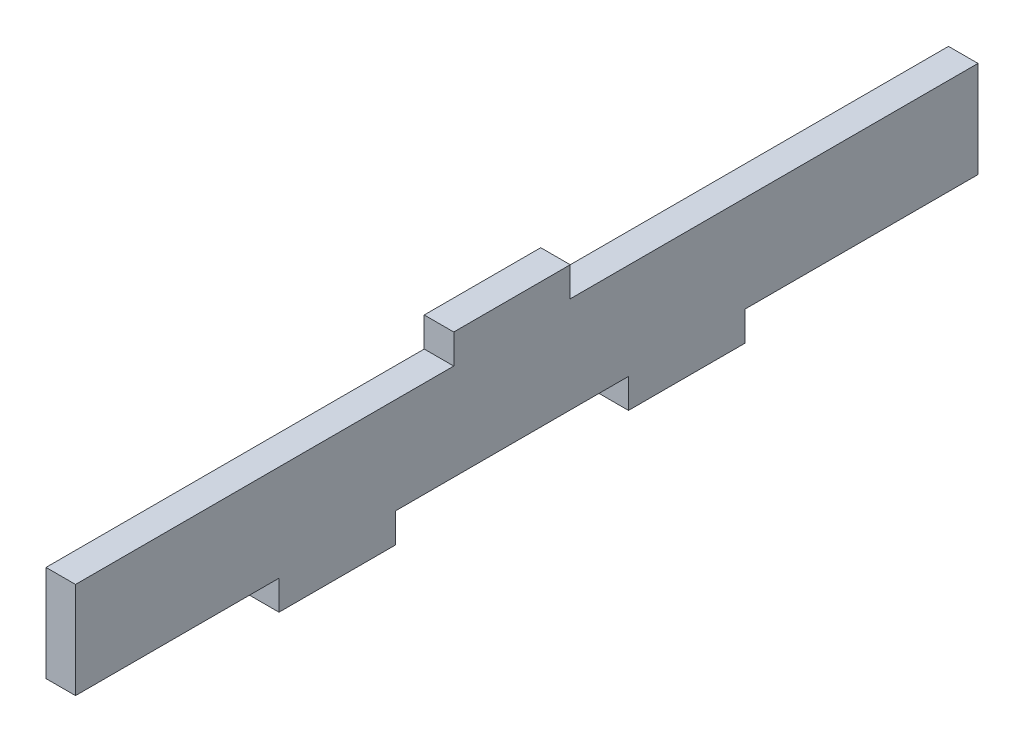
ISO-10303-21;
HEADER;
FILE_DESCRIPTION(('STEP AP214'),'2;1');
FILE_NAME('part.step','',(''),(''),'','','');
FILE_SCHEMA(('AUTOMOTIVE_DESIGN { 1 0 10303 214 1 1 1 1 }'));
ENDSEC;
DATA;
#1=APPLICATION_CONTEXT('core data for automotive mechanical design processes');
#2=APPLICATION_PROTOCOL_DEFINITION('international standard','automotive_design',2000,#1);
#3=PRODUCT_CONTEXT('',#1,'mechanical');
#4=PRODUCT('Part','Part','',(#3));
#5=PRODUCT_RELATED_PRODUCT_CATEGORY('part','',(#4));
#6=PRODUCT_DEFINITION_FORMATION('','',#4);
#7=PRODUCT_DEFINITION_CONTEXT('part definition',#1,'design');
#8=PRODUCT_DEFINITION('design','',#6,#7);
#9=PRODUCT_DEFINITION_SHAPE('','',#8);
#10=(LENGTH_UNIT() NAMED_UNIT(*) SI_UNIT(.MILLI.,.METRE.));
#11=(NAMED_UNIT(*) PLANE_ANGLE_UNIT() SI_UNIT($,.RADIAN.));
#12=(NAMED_UNIT(*) SI_UNIT($,.STERADIAN.) SOLID_ANGLE_UNIT());
#13=UNCERTAINTY_MEASURE_WITH_UNIT(LENGTH_MEASURE(1.E-05),#10,'distance_accuracy_value','');
#14=(GEOMETRIC_REPRESENTATION_CONTEXT(3) GLOBAL_UNCERTAINTY_ASSIGNED_CONTEXT((#13)) GLOBAL_UNIT_ASSIGNED_CONTEXT((#10,
#11,#12)) REPRESENTATION_CONTEXT('',''));
#15=CARTESIAN_POINT('',(0.,0.,0.));
#16=DIRECTION('',(0.,0.,1.));
#17=DIRECTION('',(1.,0.,0.));
#18=AXIS2_PLACEMENT_3D('',#15,#16,#17);
#19=CARTESIAN_POINT('',(4.826,0.,0.));
#20=DIRECTION('',(0.,1.,0.));
#21=DIRECTION('',(0.,0.,1.));
#22=AXIS2_PLACEMENT_3D('',#19,#20,#21);
#23=PLANE('',#22);
#24=DIRECTION('',(0.,0.,-1.));
#25=VECTOR('',#24,1.);
#26=CARTESIAN_POINT('',(0.,0.,0.));
#27=LINE('',#26,#25);
#28=CARTESIAN_POINT('',(0.,0.,-38.1));
#29=VERTEX_POINT('',#28);
#30=CARTESIAN_POINT('',(0.,0.,-57.15));
#31=VERTEX_POINT('',#30);
#32=EDGE_CURVE('E185',#29,#31,#27,.T.);
#33=ORIENTED_EDGE('',*,*,#32,.T.);
#34=DIRECTION('',(1.,0.,0.));
#35=VECTOR('',#34,1.);
#36=CARTESIAN_POINT('',(0.,0.,-57.15));
#37=LINE('',#36,#35);
#38=CARTESIAN_POINT('',(4.826,0.,-57.15));
#39=VERTEX_POINT('',#38);
#40=EDGE_CURVE('E239',#31,#39,#37,.T.);
#41=ORIENTED_EDGE('',*,*,#40,.T.);
#42=DIRECTION('',(0.,0.,-1.));
#43=VECTOR('',#42,1.);
#44=CARTESIAN_POINT('',(4.826,0.,0.));
#45=LINE('',#44,#43);
#46=CARTESIAN_POINT('',(4.826,0.,-38.1));
#47=VERTEX_POINT('',#46);
#48=EDGE_CURVE('E179',#47,#39,#45,.T.);
#49=ORIENTED_EDGE('',*,*,#48,.F.);
#50=DIRECTION('',(1.,0.,0.));
#51=VECTOR('',#50,1.);
#52=CARTESIAN_POINT('',(0.,0.,-38.1));
#53=LINE('',#52,#51);
#54=EDGE_CURVE('E165',#29,#47,#53,.T.);
#55=ORIENTED_EDGE('',*,*,#54,.F.);
#56=EDGE_LOOP('',(#33,#41,#49,#55));
#57=FACE_BOUND('',#56,.T.);
#58=ADVANCED_FACE('F32',(#57),#23,.F.);
#59=CARTESIAN_POINT('',(0.,0.,-95.25));
#60=VERTEX_POINT('',#59);
#61=CARTESIAN_POINT('',(0.,0.,-114.3));
#62=VERTEX_POINT('',#61);
#63=EDGE_CURVE('E177',#60,#62,#27,.T.);
#64=ORIENTED_EDGE('',*,*,#63,.T.);
#65=DIRECTION('',(1.,0.,0.));
#66=VECTOR('',#65,1.);
#67=CARTESIAN_POINT('',(0.,0.,-114.3));
#68=LINE('',#67,#66);
#69=CARTESIAN_POINT('',(4.826,0.,-114.3));
#70=VERTEX_POINT('',#69);
#71=EDGE_CURVE('E216',#62,#70,#68,.T.);
#72=ORIENTED_EDGE('',*,*,#71,.T.);
#73=CARTESIAN_POINT('',(4.826,0.,-95.25));
#74=VERTEX_POINT('',#73);
#75=EDGE_CURVE('E182',#74,#70,#45,.T.);
#76=ORIENTED_EDGE('',*,*,#75,.F.);
#77=DIRECTION('',(1.,0.,0.));
#78=VECTOR('',#77,1.);
#79=CARTESIAN_POINT('',(0.,0.,-95.25));
#80=LINE('',#79,#78);
#81=EDGE_CURVE('E214',#60,#74,#80,.T.);
#82=ORIENTED_EDGE('',*,*,#81,.F.);
#83=EDGE_LOOP('',(#64,#72,#76,#82));
#84=FACE_BOUND('',#83,.T.);
#85=ADVANCED_FACE('F34',(#84),#23,.F.);
#86=CARTESIAN_POINT('',(4.826,0.,-152.4));
#87=DIRECTION('',(0.,0.,1.));
#88=DIRECTION('',(1.,0.,0.));
#89=AXIS2_PLACEMENT_3D('',#86,#87,#88);
#90=PLANE('',#89);
#91=DIRECTION('',(0.,1.,0.));
#92=VECTOR('',#91,1.);
#93=CARTESIAN_POINT('',(0.,0.,-152.4));
#94=LINE('',#93,#92);
#95=CARTESIAN_POINT('',(0.,4.826,-152.4));
#96=VERTEX_POINT('',#95);
#97=CARTESIAN_POINT('',(0.,20.574,-152.4));
#98=VERTEX_POINT('',#97);
#99=EDGE_CURVE('E187',#96,#98,#94,.T.);
#100=ORIENTED_EDGE('',*,*,#99,.T.);
#101=DIRECTION('',(1.,0.,0.));
#102=VECTOR('',#101,1.);
#103=CARTESIAN_POINT('',(0.,20.574,-152.4));
#104=LINE('',#103,#102);
#105=CARTESIAN_POINT('',(4.826,20.574,-152.4));
#106=VERTEX_POINT('',#105);
#107=EDGE_CURVE('E285',#98,#106,#104,.T.);
#108=ORIENTED_EDGE('',*,*,#107,.T.);
#109=DIRECTION('',(0.,1.,0.));
#110=VECTOR('',#109,1.);
#111=CARTESIAN_POINT('',(4.826,0.,-152.4));
#112=LINE('',#111,#110);
#113=CARTESIAN_POINT('',(4.826,4.826,-152.4));
#114=VERTEX_POINT('',#113);
#115=EDGE_CURVE('E41',#114,#106,#112,.T.);
#116=ORIENTED_EDGE('',*,*,#115,.F.);
#117=DIRECTION('',(1.,0.,0.));
#118=VECTOR('',#117,1.);
#119=CARTESIAN_POINT('',(0.,4.826,-152.4));
#120=LINE('',#119,#118);
#121=EDGE_CURVE('E223',#96,#114,#120,.T.);
#122=ORIENTED_EDGE('',*,*,#121,.F.);
#123=EDGE_LOOP('',(#100,#108,#116,#122));
#124=FACE_BOUND('',#123,.T.);
#125=ADVANCED_FACE('F316',(#124),#90,.F.);
#126=CARTESIAN_POINT('',(4.826,25.4,0.));
#127=DIRECTION('',(0.,-1.,0.));
#128=DIRECTION('',(0.,0.,-1.));
#129=AXIS2_PLACEMENT_3D('',#126,#127,#128);
#130=PLANE('',#129);
#131=DIRECTION('',(0.,0.,1.));
#132=VECTOR('',#131,1.);
#133=CARTESIAN_POINT('',(4.826,25.4,0.));
#134=LINE('',#133,#132);
#135=CARTESIAN_POINT('',(4.826,25.4,-85.725));
#136=VERTEX_POINT('',#135);
#137=CARTESIAN_POINT('',(4.826,25.4,-66.675));
#138=VERTEX_POINT('',#137);
#139=EDGE_CURVE('E11',#136,#138,#134,.T.);
#140=ORIENTED_EDGE('',*,*,#139,.F.);
#141=DIRECTION('',(1.,0.,0.));
#142=VECTOR('',#141,1.);
#143=CARTESIAN_POINT('',(0.,25.4,-85.725));
#144=LINE('',#143,#142);
#145=CARTESIAN_POINT('',(0.,25.4,-85.725));
#146=VERTEX_POINT('',#145);
#147=EDGE_CURVE('E289',#146,#136,#144,.T.);
#148=ORIENTED_EDGE('',*,*,#147,.F.);
#149=DIRECTION('',(0.,0.,1.));
#150=VECTOR('',#149,1.);
#151=CARTESIAN_POINT('',(0.,25.4,0.));
#152=LINE('',#151,#150);
#153=CARTESIAN_POINT('',(0.,25.4,-66.675));
#154=VERTEX_POINT('',#153);
#155=EDGE_CURVE('E36',#146,#154,#152,.T.);
#156=ORIENTED_EDGE('',*,*,#155,.T.);
#157=DIRECTION('',(1.,0.,0.));
#158=VECTOR('',#157,1.);
#159=CARTESIAN_POINT('',(0.,25.4,-66.675));
#160=LINE('',#159,#158);
#161=EDGE_CURVE('E271',#154,#138,#160,.T.);
#162=ORIENTED_EDGE('',*,*,#161,.T.);
#163=EDGE_LOOP('',(#140,#148,#156,#162));
#164=FACE_BOUND('',#163,.T.);
#165=ADVANCED_FACE('F314',(#164),#130,.F.);
#166=CARTESIAN_POINT('',(4.826,0.,0.));
#167=DIRECTION('',(-1.,0.,0.));
#168=DIRECTION('',(0.,0.,1.));
#169=AXIS2_PLACEMENT_3D('',#166,#167,#168);
#170=PLANE('',#169);
#171=DIRECTION('',(0.,0.,-1.));
#172=VECTOR('',#171,1.);
#173=CARTESIAN_POINT('',(4.826,20.574,0.));
#174=LINE('',#173,#172);
#175=CARTESIAN_POINT('',(4.826,20.574,-4.826));
#176=VERTEX_POINT('',#175);
#177=CARTESIAN_POINT('',(4.826,20.574,-66.675));
#178=VERTEX_POINT('',#177);
#179=EDGE_CURVE('E283',#176,#178,#174,.T.);
#180=ORIENTED_EDGE('',*,*,#179,.F.);
#181=DIRECTION('',(0.,1.,0.));
#182=VECTOR('',#181,1.);
#183=CARTESIAN_POINT('',(4.826,4.826,-4.826));
#184=LINE('',#183,#182);
#185=CARTESIAN_POINT('',(4.826,4.826,-4.826));
#186=VERTEX_POINT('',#185);
#187=EDGE_CURVE('E49',#186,#176,#184,.T.);
#188=ORIENTED_EDGE('',*,*,#187,.F.);
#189=DIRECTION('',(0.,0.,1.));
#190=VECTOR('',#189,1.);
#191=CARTESIAN_POINT('',(4.826,4.826,0.));
#192=LINE('',#191,#190);
#193=CARTESIAN_POINT('',(4.826,4.826,-38.1));
#194=VERTEX_POINT('',#193);
#195=EDGE_CURVE('E159',#194,#186,#192,.T.);
#196=ORIENTED_EDGE('',*,*,#195,.F.);
#197=DIRECTION('',(0.,1.,0.));
#198=VECTOR('',#197,1.);
#199=CARTESIAN_POINT('',(4.826,0.,-38.1));
#200=LINE('',#199,#198);
#201=EDGE_CURVE('E172',#47,#194,#200,.T.);
#202=ORIENTED_EDGE('',*,*,#201,.F.);
#203=ORIENTED_EDGE('',*,*,#48,.T.);
#204=DIRECTION('',(0.,-1.,0.));
#205=VECTOR('',#204,1.);
#206=CARTESIAN_POINT('',(4.826,0.,-57.15));
#207=LINE('',#206,#205);
#208=CARTESIAN_POINT('',(4.826,4.826,-57.15));
#209=VERTEX_POINT('',#208);
#210=EDGE_CURVE('E219',#209,#39,#207,.T.);
#211=ORIENTED_EDGE('',*,*,#210,.F.);
#212=DIRECTION('',(0.,0.,1.));
#213=VECTOR('',#212,1.);
#214=CARTESIAN_POINT('',(4.826,4.826,-57.15));
#215=LINE('',#214,#213);
#216=CARTESIAN_POINT('',(4.826,4.826,-95.25));
#217=VERTEX_POINT('',#216);
#218=EDGE_CURVE('E234',#217,#209,#215,.T.);
#219=ORIENTED_EDGE('',*,*,#218,.F.);
#220=DIRECTION('',(0.,1.,0.));
#221=VECTOR('',#220,1.);
#222=CARTESIAN_POINT('',(4.826,0.,-95.25));
#223=LINE('',#222,#221);
#224=EDGE_CURVE('E209',#74,#217,#223,.T.);
#225=ORIENTED_EDGE('',*,*,#224,.F.);
#226=ORIENTED_EDGE('',*,*,#75,.T.);
#227=DIRECTION('',(0.,-1.,0.));
#228=VECTOR('',#227,1.);
#229=CARTESIAN_POINT('',(4.826,0.,-114.3));
#230=LINE('',#229,#228);
#231=CARTESIAN_POINT('',(4.826,4.826,-114.3));
#232=VERTEX_POINT('',#231);
#233=EDGE_CURVE('E206',#232,#70,#230,.T.);
#234=ORIENTED_EDGE('',*,*,#233,.F.);
#235=DIRECTION('',(0.,0.,1.));
#236=VECTOR('',#235,1.);
#237=CARTESIAN_POINT('',(4.826,4.826,-152.4));
#238=LINE('',#237,#236);
#239=EDGE_CURVE('E269',#114,#232,#238,.T.);
#240=ORIENTED_EDGE('',*,*,#239,.F.);
#241=ORIENTED_EDGE('',*,*,#115,.T.);
#242=DIRECTION('',(0.,0.,-1.));
#243=VECTOR('',#242,1.);
#244=CARTESIAN_POINT('',(4.826,20.574,-152.4));
#245=LINE('',#244,#243);
#246=CARTESIAN_POINT('',(4.826,20.574,-85.725));
#247=VERTEX_POINT('',#246);
#248=EDGE_CURVE('E294',#247,#106,#245,.T.);
#249=ORIENTED_EDGE('',*,*,#248,.F.);
#250=DIRECTION('',(0.,-1.,0.));
#251=VECTOR('',#250,1.);
#252=CARTESIAN_POINT('',(4.826,25.4,-85.725));
#253=LINE('',#252,#251);
#254=EDGE_CURVE('E297',#136,#247,#253,.T.);
#255=ORIENTED_EDGE('',*,*,#254,.F.);
#256=ORIENTED_EDGE('',*,*,#139,.T.);
#257=DIRECTION('',(0.,1.,0.));
#258=VECTOR('',#257,1.);
#259=CARTESIAN_POINT('',(4.826,25.4,-66.675));
#260=LINE('',#259,#258);
#261=EDGE_CURVE('E279',#178,#138,#260,.T.);
#262=ORIENTED_EDGE('',*,*,#261,.F.);
#263=EDGE_LOOP('',(#180,#188,#196,#202,#203,#211,#219,#225,#226,#234,#240,#241,#249,#255,#256,#262));
#264=FACE_BOUND('',#263,.T.);
#265=ADVANCED_FACE('F204',(#264),#170,.F.);
#266=CARTESIAN_POINT('',(0.,0.,0.));
#267=DIRECTION('',(-1.,0.,0.));
#268=DIRECTION('',(0.,0.,1.));
#269=AXIS2_PLACEMENT_3D('',#266,#267,#268);
#270=PLANE('',#269);
#271=DIRECTION('',(0.,1.,0.));
#272=VECTOR('',#271,1.);
#273=CARTESIAN_POINT('',(0.,4.826,-4.826));
#274=LINE('',#273,#272);
#275=CARTESIAN_POINT('',(0.,4.826,-4.826));
#276=VERTEX_POINT('',#275);
#277=CARTESIAN_POINT('',(0.,20.574,-4.826));
#278=VERTEX_POINT('',#277);
#279=EDGE_CURVE('E144',#276,#278,#274,.T.);
#280=ORIENTED_EDGE('',*,*,#279,.T.);
#281=DIRECTION('',(0.,0.,-1.));
#282=VECTOR('',#281,1.);
#283=CARTESIAN_POINT('',(0.,20.574,0.));
#284=LINE('',#283,#282);
#285=CARTESIAN_POINT('',(0.,20.574,-66.675));
#286=VERTEX_POINT('',#285);
#287=EDGE_CURVE('E282',#278,#286,#284,.T.);
#288=ORIENTED_EDGE('',*,*,#287,.T.);
#289=DIRECTION('',(0.,1.,0.));
#290=VECTOR('',#289,1.);
#291=CARTESIAN_POINT('',(0.,25.4,-66.675));
#292=LINE('',#291,#290);
#293=EDGE_CURVE('E277',#286,#154,#292,.T.);
#294=ORIENTED_EDGE('',*,*,#293,.T.);
#295=ORIENTED_EDGE('',*,*,#155,.F.);
#296=DIRECTION('',(0.,-1.,0.));
#297=VECTOR('',#296,1.);
#298=CARTESIAN_POINT('',(0.,25.4,-85.725));
#299=LINE('',#298,#297);
#300=CARTESIAN_POINT('',(0.,20.574,-85.725));
#301=VERTEX_POINT('',#300);
#302=EDGE_CURVE('E296',#146,#301,#299,.T.);
#303=ORIENTED_EDGE('',*,*,#302,.T.);
#304=DIRECTION('',(0.,0.,-1.));
#305=VECTOR('',#304,1.);
#306=CARTESIAN_POINT('',(0.,20.574,-152.4));
#307=LINE('',#306,#305);
#308=EDGE_CURVE('E57',#301,#98,#307,.T.);
#309=ORIENTED_EDGE('',*,*,#308,.T.);
#310=ORIENTED_EDGE('',*,*,#99,.F.);
#311=DIRECTION('',(0.,0.,1.));
#312=VECTOR('',#311,1.);
#313=CARTESIAN_POINT('',(0.,4.826,-152.4));
#314=LINE('',#313,#312);
#315=CARTESIAN_POINT('',(0.,4.826,-114.3));
#316=VERTEX_POINT('',#315);
#317=EDGE_CURVE('E264',#96,#316,#314,.T.);
#318=ORIENTED_EDGE('',*,*,#317,.T.);
#319=DIRECTION('',(0.,-1.,0.));
#320=VECTOR('',#319,1.);
#321=CARTESIAN_POINT('',(0.,0.,-114.3));
#322=LINE('',#321,#320);
#323=EDGE_CURVE('E229',#316,#62,#322,.T.);
#324=ORIENTED_EDGE('',*,*,#323,.T.);
#325=ORIENTED_EDGE('',*,*,#63,.F.);
#326=DIRECTION('',(0.,1.,0.));
#327=VECTOR('',#326,1.);
#328=CARTESIAN_POINT('',(0.,0.,-95.25));
#329=LINE('',#328,#327);
#330=CARTESIAN_POINT('',(0.,4.826,-95.25));
#331=VERTEX_POINT('',#330);
#332=EDGE_CURVE('E233',#60,#331,#329,.T.);
#333=ORIENTED_EDGE('',*,*,#332,.T.);
#334=DIRECTION('',(0.,0.,1.));
#335=VECTOR('',#334,1.);
#336=CARTESIAN_POINT('',(0.,4.826,-57.15));
#337=LINE('',#336,#335);
#338=CARTESIAN_POINT('',(0.,4.826,-57.15));
#339=VERTEX_POINT('',#338);
#340=EDGE_CURVE('E237',#331,#339,#337,.T.);
#341=ORIENTED_EDGE('',*,*,#340,.T.);
#342=DIRECTION('',(0.,-1.,0.));
#343=VECTOR('',#342,1.);
#344=CARTESIAN_POINT('',(0.,0.,-57.15));
#345=LINE('',#344,#343);
#346=EDGE_CURVE('E230',#339,#31,#345,.T.);
#347=ORIENTED_EDGE('',*,*,#346,.T.);
#348=ORIENTED_EDGE('',*,*,#32,.F.);
#349=DIRECTION('',(0.,1.,0.));
#350=VECTOR('',#349,1.);
#351=CARTESIAN_POINT('',(0.,0.,-38.1));
#352=LINE('',#351,#350);
#353=CARTESIAN_POINT('',(0.,4.826,-38.1));
#354=VERTEX_POINT('',#353);
#355=EDGE_CURVE('E164',#29,#354,#352,.T.);
#356=ORIENTED_EDGE('',*,*,#355,.T.);
#357=DIRECTION('',(0.,0.,1.));
#358=VECTOR('',#357,1.);
#359=CARTESIAN_POINT('',(0.,4.826,0.));
#360=LINE('',#359,#358);
#361=EDGE_CURVE('E156',#354,#276,#360,.T.);
#362=ORIENTED_EDGE('',*,*,#361,.T.);
#363=EDGE_LOOP('',(#280,#288,#294,#295,#303,#309,#310,#318,#324,#325,#333,#341,#347,#348,#356,#362));
#364=FACE_BOUND('',#363,.T.);
#365=ADVANCED_FACE('F162',(#364),#270,.T.);
#366=CARTESIAN_POINT('',(0.,4.826,0.));
#367=DIRECTION('',(0.,1.,0.));
#368=DIRECTION('',(0.,0.,1.));
#369=AXIS2_PLACEMENT_3D('',#366,#367,#368);
#370=PLANE('',#369);
#371=ORIENTED_EDGE('',*,*,#195,.T.);
#372=DIRECTION('',(1.,0.,0.));
#373=VECTOR('',#372,1.);
#374=CARTESIAN_POINT('',(0.,4.826,-4.826));
#375=LINE('',#374,#373);
#376=EDGE_CURVE('E147',#276,#186,#375,.T.);
#377=ORIENTED_EDGE('',*,*,#376,.F.);
#378=ORIENTED_EDGE('',*,*,#361,.F.);
#379=DIRECTION('',(1.,0.,0.));
#380=VECTOR('',#379,1.);
#381=CARTESIAN_POINT('',(0.,4.826,-38.1));
#382=LINE('',#381,#380);
#383=EDGE_CURVE('E167',#354,#194,#382,.T.);
#384=ORIENTED_EDGE('',*,*,#383,.T.);
#385=EDGE_LOOP('',(#371,#377,#378,#384));
#386=FACE_BOUND('',#385,.T.);
#387=ADVANCED_FACE('F155',(#386),#370,.F.);
#388=CARTESIAN_POINT('',(0.,0.,-38.1));
#389=DIRECTION('',(0.,0.,-1.));
#390=DIRECTION('',(-1.,0.,0.));
#391=AXIS2_PLACEMENT_3D('',#388,#389,#390);
#392=PLANE('',#391);
#393=ORIENTED_EDGE('',*,*,#201,.T.);
#394=ORIENTED_EDGE('',*,*,#383,.F.);
#395=ORIENTED_EDGE('',*,*,#355,.F.);
#396=ORIENTED_EDGE('',*,*,#54,.T.);
#397=EDGE_LOOP('',(#393,#394,#395,#396));
#398=FACE_BOUND('',#397,.T.);
#399=ADVANCED_FACE('F256',(#398),#392,.F.);
#400=CARTESIAN_POINT('',(0.,0.,-57.15));
#401=DIRECTION('',(0.,0.,1.));
#402=DIRECTION('',(1.,0.,0.));
#403=AXIS2_PLACEMENT_3D('',#400,#401,#402);
#404=PLANE('',#403);
#405=ORIENTED_EDGE('',*,*,#210,.T.);
#406=ORIENTED_EDGE('',*,*,#40,.F.);
#407=ORIENTED_EDGE('',*,*,#346,.F.);
#408=DIRECTION('',(1.,0.,0.));
#409=VECTOR('',#408,1.);
#410=CARTESIAN_POINT('',(0.,4.826,-57.15));
#411=LINE('',#410,#409);
#412=EDGE_CURVE('E175',#339,#209,#411,.T.);
#413=ORIENTED_EDGE('',*,*,#412,.T.);
#414=EDGE_LOOP('',(#405,#406,#407,#413));
#415=FACE_BOUND('',#414,.T.);
#416=ADVANCED_FACE('F257',(#415),#404,.F.);
#417=CARTESIAN_POINT('',(0.,4.826,-57.15));
#418=DIRECTION('',(0.,1.,0.));
#419=DIRECTION('',(0.,0.,1.));
#420=AXIS2_PLACEMENT_3D('',#417,#418,#419);
#421=PLANE('',#420);
#422=ORIENTED_EDGE('',*,*,#218,.T.);
#423=ORIENTED_EDGE('',*,*,#412,.F.);
#424=ORIENTED_EDGE('',*,*,#340,.F.);
#425=DIRECTION('',(1.,0.,0.));
#426=VECTOR('',#425,1.);
#427=CARTESIAN_POINT('',(0.,4.826,-95.25));
#428=LINE('',#427,#426);
#429=EDGE_CURVE('E245',#331,#217,#428,.T.);
#430=ORIENTED_EDGE('',*,*,#429,.T.);
#431=EDGE_LOOP('',(#422,#423,#424,#430));
#432=FACE_BOUND('',#431,.T.);
#433=ADVANCED_FACE('F259',(#432),#421,.F.);
#434=CARTESIAN_POINT('',(0.,0.,-95.25));
#435=DIRECTION('',(0.,0.,-1.));
#436=DIRECTION('',(-1.,0.,0.));
#437=AXIS2_PLACEMENT_3D('',#434,#435,#436);
#438=PLANE('',#437);
#439=ORIENTED_EDGE('',*,*,#224,.T.);
#440=ORIENTED_EDGE('',*,*,#429,.F.);
#441=ORIENTED_EDGE('',*,*,#332,.F.);
#442=ORIENTED_EDGE('',*,*,#81,.T.);
#443=EDGE_LOOP('',(#439,#440,#441,#442));
#444=FACE_BOUND('',#443,.T.);
#445=ADVANCED_FACE('F262',(#444),#438,.F.);
#446=CARTESIAN_POINT('',(0.,0.,-114.3));
#447=DIRECTION('',(0.,0.,1.));
#448=DIRECTION('',(0.,-1.,0.));
#449=AXIS2_PLACEMENT_3D('',#446,#447,#448);
#450=PLANE('',#449);
#451=ORIENTED_EDGE('',*,*,#233,.T.);
#452=ORIENTED_EDGE('',*,*,#71,.F.);
#453=ORIENTED_EDGE('',*,*,#323,.F.);
#454=DIRECTION('',(1.,0.,0.));
#455=VECTOR('',#454,1.);
#456=CARTESIAN_POINT('',(0.,4.826,-114.3));
#457=LINE('',#456,#455);
#458=EDGE_CURVE('E220',#316,#232,#457,.T.);
#459=ORIENTED_EDGE('',*,*,#458,.T.);
#460=EDGE_LOOP('',(#451,#452,#453,#459));
#461=FACE_BOUND('',#460,.T.);
#462=ADVANCED_FACE('F365',(#461),#450,.F.);
#463=CARTESIAN_POINT('',(0.,4.826,-152.4));
#464=DIRECTION('',(0.,1.,0.));
#465=DIRECTION('',(0.,0.,1.));
#466=AXIS2_PLACEMENT_3D('',#463,#464,#465);
#467=PLANE('',#466);
#468=ORIENTED_EDGE('',*,*,#239,.T.);
#469=ORIENTED_EDGE('',*,*,#458,.F.);
#470=ORIENTED_EDGE('',*,*,#317,.F.);
#471=ORIENTED_EDGE('',*,*,#121,.T.);
#472=EDGE_LOOP('',(#468,#469,#470,#471));
#473=FACE_BOUND('',#472,.T.);
#474=ADVANCED_FACE('F374',(#473),#467,.F.);
#475=CARTESIAN_POINT('',(0.,25.4,-66.675));
#476=DIRECTION('',(0.,0.,-1.));
#477=DIRECTION('',(-1.,0.,0.));
#478=AXIS2_PLACEMENT_3D('',#475,#476,#477);
#479=PLANE('',#478);
#480=ORIENTED_EDGE('',*,*,#261,.T.);
#481=ORIENTED_EDGE('',*,*,#161,.F.);
#482=ORIENTED_EDGE('',*,*,#293,.F.);
#483=DIRECTION('',(1.,0.,0.));
#484=VECTOR('',#483,1.);
#485=CARTESIAN_POINT('',(0.,20.574,-66.675));
#486=LINE('',#485,#484);
#487=EDGE_CURVE('E273',#286,#178,#486,.T.);
#488=ORIENTED_EDGE('',*,*,#487,.T.);
#489=EDGE_LOOP('',(#480,#481,#482,#488));
#490=FACE_BOUND('',#489,.T.);
#491=ADVANCED_FACE('F310',(#490),#479,.F.);
#492=CARTESIAN_POINT('',(0.,20.574,0.));
#493=DIRECTION('',(0.,-1.,0.));
#494=DIRECTION('',(0.,0.,-1.));
#495=AXIS2_PLACEMENT_3D('',#492,#493,#494);
#496=PLANE('',#495);
#497=ORIENTED_EDGE('',*,*,#287,.F.);
#498=DIRECTION('',(1.,0.,0.));
#499=VECTOR('',#498,1.);
#500=CARTESIAN_POINT('',(0.,20.574,-4.826));
#501=LINE('',#500,#499);
#502=EDGE_CURVE('E148',#278,#176,#501,.T.);
#503=ORIENTED_EDGE('',*,*,#502,.T.);
#504=ORIENTED_EDGE('',*,*,#179,.T.);
#505=ORIENTED_EDGE('',*,*,#487,.F.);
#506=EDGE_LOOP('',(#497,#503,#504,#505));
#507=FACE_BOUND('',#506,.T.);
#508=ADVANCED_FACE('F305',(#507),#496,.F.);
#509=CARTESIAN_POINT('',(0.,20.574,-152.4));
#510=DIRECTION('',(0.,-1.,0.));
#511=DIRECTION('',(0.,0.,-1.));
#512=AXIS2_PLACEMENT_3D('',#509,#510,#511);
#513=PLANE('',#512);
#514=ORIENTED_EDGE('',*,*,#248,.T.);
#515=ORIENTED_EDGE('',*,*,#107,.F.);
#516=ORIENTED_EDGE('',*,*,#308,.F.);
#517=DIRECTION('',(1.,0.,0.));
#518=VECTOR('',#517,1.);
#519=CARTESIAN_POINT('',(0.,20.574,-85.725));
#520=LINE('',#519,#518);
#521=EDGE_CURVE('E291',#301,#247,#520,.T.);
#522=ORIENTED_EDGE('',*,*,#521,.T.);
#523=EDGE_LOOP('',(#514,#515,#516,#522));
#524=FACE_BOUND('',#523,.T.);
#525=ADVANCED_FACE('F426',(#524),#513,.F.);
#526=CARTESIAN_POINT('',(0.,25.4,-85.725));
#527=DIRECTION('',(0.,0.,1.));
#528=DIRECTION('',(1.,0.,0.));
#529=AXIS2_PLACEMENT_3D('',#526,#527,#528);
#530=PLANE('',#529);
#531=ORIENTED_EDGE('',*,*,#254,.T.);
#532=ORIENTED_EDGE('',*,*,#521,.F.);
#533=ORIENTED_EDGE('',*,*,#302,.F.);
#534=ORIENTED_EDGE('',*,*,#147,.T.);
#535=EDGE_LOOP('',(#531,#532,#533,#534));
#536=FACE_BOUND('',#535,.T.);
#537=ADVANCED_FACE('F313',(#536),#530,.F.);
#538=CARTESIAN_POINT('',(0.,4.826,-4.826));
#539=DIRECTION('',(0.,0.,-1.));
#540=DIRECTION('',(-1.,0.,0.));
#541=AXIS2_PLACEMENT_3D('',#538,#539,#540);
#542=PLANE('',#541);
#543=ORIENTED_EDGE('',*,*,#187,.T.);
#544=ORIENTED_EDGE('',*,*,#502,.F.);
#545=ORIENTED_EDGE('',*,*,#279,.F.);
#546=ORIENTED_EDGE('',*,*,#376,.T.);
#547=EDGE_LOOP('',(#543,#544,#545,#546));
#548=FACE_BOUND('',#547,.T.);
#549=ADVANCED_FACE('F146',(#548),#542,.F.);
#550=CLOSED_SHELL('',(#58,#85,#125,#165,#265,#365,#387,#399,#416,#433,#445,#462,#474,#491,#508,
#525,#537,#549));
#551=MANIFOLD_SOLID_BREP('B2',#550);
#552=ADVANCED_BREP_SHAPE_REPRESENTATION('',(#18,#551),#14);
#553=SHAPE_DEFINITION_REPRESENTATION(#9,#552);
ENDSEC;
END-ISO-10303-21;
